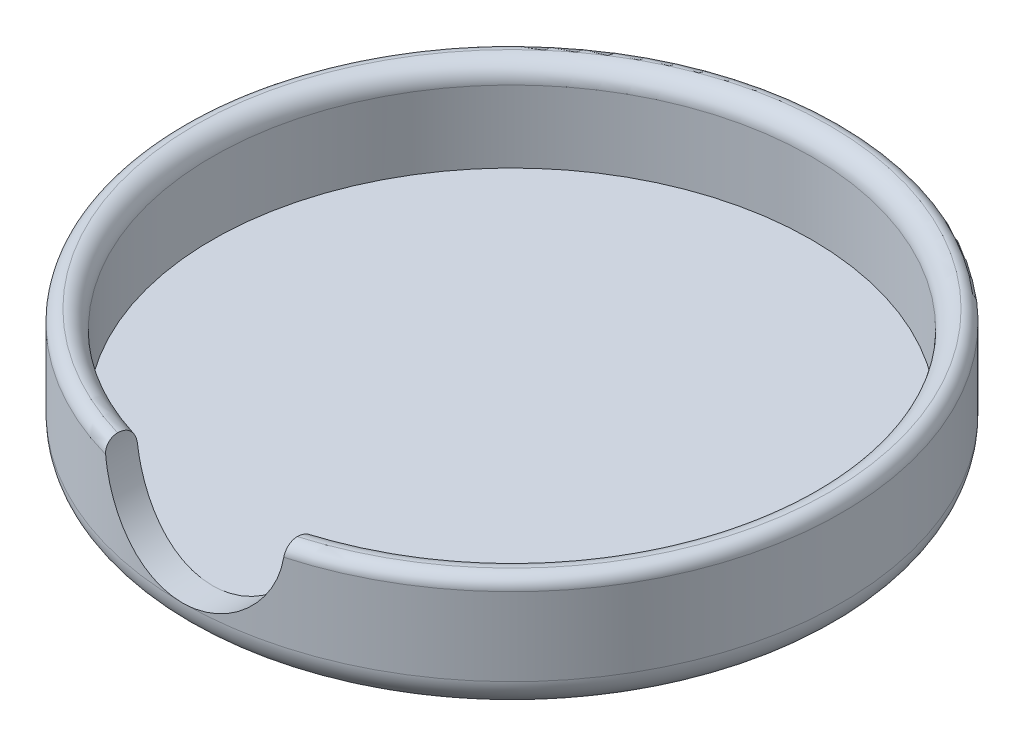
ISO-10303-21;
HEADER;
FILE_DESCRIPTION(('STEP AP214'),'2;1');
FILE_NAME('part.step','',(''),(''),'','','');
FILE_SCHEMA(('AUTOMOTIVE_DESIGN { 1 0 10303 214 1 1 1 1 }'));
ENDSEC;
DATA;
#1=APPLICATION_CONTEXT('core data for automotive mechanical design processes');
#2=APPLICATION_PROTOCOL_DEFINITION('international standard','automotive_design',2000,#1);
#3=PRODUCT_CONTEXT('',#1,'mechanical');
#4=PRODUCT('Part','Part','',(#3));
#5=PRODUCT_RELATED_PRODUCT_CATEGORY('part','',(#4));
#6=PRODUCT_DEFINITION_FORMATION('','',#4);
#7=PRODUCT_DEFINITION_CONTEXT('part definition',#1,'design');
#8=PRODUCT_DEFINITION('design','',#6,#7);
#9=PRODUCT_DEFINITION_SHAPE('','',#8);
#10=(LENGTH_UNIT() NAMED_UNIT(*) SI_UNIT(.MILLI.,.METRE.));
#11=(NAMED_UNIT(*) PLANE_ANGLE_UNIT() SI_UNIT($,.RADIAN.));
#12=(NAMED_UNIT(*) SI_UNIT($,.STERADIAN.) SOLID_ANGLE_UNIT());
#13=UNCERTAINTY_MEASURE_WITH_UNIT(LENGTH_MEASURE(1.E-05),#10,'distance_accuracy_value','');
#14=(GEOMETRIC_REPRESENTATION_CONTEXT(3) GLOBAL_UNCERTAINTY_ASSIGNED_CONTEXT((#13)) GLOBAL_UNIT_ASSIGNED_CONTEXT((#10,
#11,#12)) REPRESENTATION_CONTEXT('',''));
#15=CARTESIAN_POINT('',(0.,0.,0.));
#16=DIRECTION('',(0.,0.,1.));
#17=DIRECTION('',(1.,0.,0.));
#18=AXIS2_PLACEMENT_3D('',#15,#16,#17);
#19=CARTESIAN_POINT('',(0.,0.,0.));
#20=DIRECTION('',(0.,1.,0.));
#21=DIRECTION('',(0.,0.,1.));
#22=AXIS2_PLACEMENT_3D('',#19,#20,#21);
#23=PLANE('',#22);
#24=CARTESIAN_POINT('',(0.,0.,0.));
#25=DIRECTION('',(0.,1.,0.));
#26=DIRECTION('',(0.,0.,1.));
#27=AXIS2_PLACEMENT_3D('',#24,#25,#26);
#28=CIRCLE('',#27,50.);
#29=CARTESIAN_POINT('',(0.,0.,50.));
#30=VERTEX_POINT('',#29);
#31=EDGE_CURVE('E150',#30,#30,#28,.F.);
#32=ORIENTED_EDGE('',*,*,#31,.T.);
#33=EDGE_LOOP('',(#32));
#34=FACE_BOUND('',#33,.T.);
#35=ADVANCED_FACE('F37',(#34),#23,.F.);
#36=CARTESIAN_POINT('',(0.,5.,0.));
#37=DIRECTION('',(0.,1.,0.));
#38=DIRECTION('',(0.,0.,1.));
#39=AXIS2_PLACEMENT_3D('',#36,#37,#38);
#40=TOROIDAL_SURFACE('',#39,50.,5.);
#41=ORIENTED_EDGE('',*,*,#31,.F.);
#42=EDGE_LOOP('',(#41));
#43=FACE_BOUND('',#42,.T.);
#44=CARTESIAN_POINT('',(0.,5.,0.));
#45=DIRECTION('',(0.,1.,0.));
#46=DIRECTION('',(0.,0.,1.));
#47=AXIS2_PLACEMENT_3D('',#44,#45,#46);
#48=CIRCLE('',#47,55.);
#49=CARTESIAN_POINT('',(0.,5.,55.));
#50=VERTEX_POINT('',#49);
#51=EDGE_CURVE('E78',#50,#50,#48,.T.);
#52=ORIENTED_EDGE('',*,*,#51,.F.);
#53=EDGE_LOOP('',(#52));
#54=FACE_BOUND('',#53,.T.);
#55=ADVANCED_FACE('F163',(#43,#54),#40,.T.);
#56=CARTESIAN_POINT('',(0.,20.,0.));
#57=DIRECTION('',(0.,-1.,0.));
#58=DIRECTION('',(0.,0.,-1.));
#59=AXIS2_PLACEMENT_3D('',#56,#57,#58);
#60=CYLINDRICAL_SURFACE('',#59,55.);
#61=CARTESIAN_POINT('',(15.,20.,52.9150262212918));
#62=CARTESIAN_POINT('',(15.000000286484,19.793253766593,52.9150243606805));
#63=CARTESIAN_POINT('',(14.9957248566018,19.5865336685996,52.9162383360573));
#64=CARTESIAN_POINT('',(14.9786381452183,19.1734813981911,52.9210781578686));
#65=CARTESIAN_POINT('',(14.9658271362087,18.9671492136031,52.9247039273084));
#66=CARTESIAN_POINT('',(14.9146275967153,18.3493858365201,52.939165419406));
#67=CARTESIAN_POINT('',(14.8634725260349,17.9390189955834,52.9535853572906));
#68=CARTESIAN_POINT('',(14.7277230256131,17.1252798025082,52.9915001635927));
#69=CARTESIAN_POINT('',(14.6432029212191,16.7218939699774,53.0149748586115));
#70=CARTESIAN_POINT('',(14.4414416204866,15.9239608123837,53.0702901502028));
#71=CARTESIAN_POINT('',(14.3241998015573,15.5294136556472,53.1021309059544));
#72=CARTESIAN_POINT('',(14.0579925899012,14.7519879342244,53.1732244454477));
#73=CARTESIAN_POINT('',(13.9090354669678,14.3691063574208,53.2124752966989));
#74=CARTESIAN_POINT('',(13.580532442403,13.6174155385303,53.2972597334443));
#75=CARTESIAN_POINT('',(13.4009856434971,13.2486067096221,53.3427935032253));
#76=CARTESIAN_POINT('',(13.0125641270026,12.5273155157184,53.438873408806));
#77=CARTESIAN_POINT('',(12.8036805144758,12.1748381456976,53.4894210634479));
#78=CARTESIAN_POINT('',(12.3580738121259,11.4885122832305,53.5941263152665));
#79=CARTESIAN_POINT('',(12.1213503013955,11.1546640725482,53.6482839670167));
#80=CARTESIAN_POINT('',(11.6157480263671,10.5000298523626,53.760049965193));
#81=CARTESIAN_POINT('',(11.3462445131094,10.1797349413134,53.8177094871053));
#82=CARTESIAN_POINT('',(10.7814893898106,9.56283698102187,53.9336867559217));
#83=CARTESIAN_POINT('',(10.4862373723679,9.26623430678821,53.9920045132279));
#84=CARTESIAN_POINT('',(9.87183812277975,8.69859466716366,54.1077122406303));
#85=CARTESIAN_POINT('',(9.55268693451205,8.4275619513219,54.1651020552002));
#86=CARTESIAN_POINT('',(8.89257375010994,7.91292921446159,54.2773820471512));
#87=CARTESIAN_POINT('',(8.55161193459861,7.6693289663092,54.3322722452263));
#88=CARTESIAN_POINT('',(7.8441396117305,7.2073873948333,54.438952653567));
#89=CARTESIAN_POINT('',(7.47729524123745,6.98954126336078,54.4906749830409));
#90=CARTESIAN_POINT('',(6.72578893675184,6.58561436939836,54.5885274335198));
#91=CARTESIAN_POINT('',(6.34112674041055,6.39953407481611,54.634657472148));
#92=CARTESIAN_POINT('',(5.55674288938212,6.06066385099891,54.7199981149028));
#93=CARTESIAN_POINT('',(5.1570240051163,5.90786783223388,54.7592099844942));
#94=CARTESIAN_POINT('',(4.34535261171838,5.6368191553844,54.829588889452));
#95=CARTESIAN_POINT('',(3.93340044502747,5.51856553137133,54.8607561497715));
#96=CARTESIAN_POINT('',(3.11029369365135,5.32004771446635,54.9134961688321));
#97=CARTESIAN_POINT('',(2.69935519229585,5.23894340541183,54.9352803620332));
#98=CARTESIAN_POINT('',(1.87175827152191,5.11135302606664,54.9697009704869));
#99=CARTESIAN_POINT('',(1.45509993449401,5.06486645766144,54.9823375173649));
#100=CARTESIAN_POINT('',(0.619229104616363,5.00693347884404,54.9981023756115));
#101=CARTESIAN_POINT('',(0.200016951147234,4.99548251006537,55.0012319239041));
#102=CARTESIAN_POINT('',(-0.63785289854681,5.00771266536431,54.9978967075694));
#103=CARTESIAN_POINT('',(-1.05651060296149,5.03139326458745,54.991432086276));
#104=CARTESIAN_POINT('',(-1.8791020724344,5.11258054400319,54.9693895637102));
#105=CARTESIAN_POINT('',(-2.28313263881025,5.16917712722315,54.9540569160261));
#106=CARTESIAN_POINT('',(-3.08483628626953,5.31498120055762,54.9148873294678));
#107=CARTESIAN_POINT('',(-3.4825094984601,5.40418801724639,54.8910505662101));
#108=CARTESIAN_POINT('',(-4.26877655245749,5.61448067170427,54.8355075891585));
#109=CARTESIAN_POINT('',(-4.65737016388668,5.73556731740927,54.8038011759239));
#110=CARTESIAN_POINT('',(-5.42287685642636,6.00866123657067,54.7333551684439));
#111=CARTESIAN_POINT('',(-5.79978974686026,6.16066901447894,54.6946154594573));
#112=CARTESIAN_POINT('',(-6.54328689823865,6.49616956859676,54.6106839260597));
#113=CARTESIAN_POINT('',(-6.90972566963725,6.67996912978943,54.5654300307617));
#114=CARTESIAN_POINT('',(-7.62584778019487,7.07661065704846,54.4699637846654));
#115=CARTESIAN_POINT('',(-7.97553105508699,7.28945273449742,54.4197514148507));
#116=CARTESIAN_POINT('',(-8.65602032575576,7.7427380169607,54.3156682922352));
#117=CARTESIAN_POINT('',(-8.98682352174908,7.98318529979388,54.2617969994225));
#118=CARTESIAN_POINT('',(-9.62748178923056,8.49007166615788,54.1517982633528));
#119=CARTESIAN_POINT('',(-9.93733633098693,8.75651140654805,54.0956707630999));
#120=CARTESIAN_POINT('',(-10.5437633605139,9.32261439705751,53.9808051726502));
#121=CARTESIAN_POINT('',(-10.839593728764,9.62306786884385,53.9220410122898));
#122=CARTESIAN_POINT('',(-11.4049972003909,10.2478940419935,53.8052915194173));
#123=CARTESIAN_POINT('',(-11.6745695583015,10.5722674219852,53.7473062090571));
#124=CARTESIAN_POINT('',(-12.1857102945639,11.2429299846782,53.6337305040337));
#125=CARTESIAN_POINT('',(-12.427270364292,11.589225622818,53.578140822986));
#126=CARTESIAN_POINT('',(-12.8805852122529,12.3013843788892,53.4709714858905));
#127=CARTESIAN_POINT('',(-13.0923409112096,12.667246891874,53.4193917059898));
#128=CARTESIAN_POINT('',(-13.485917360652,13.4188680767393,53.3213980128598));
#129=CARTESIAN_POINT('',(-13.6675080202456,13.8047526177029,53.2750246095597));
#130=CARTESIAN_POINT('',(-13.9974007887952,14.5912471845914,53.1893019070663));
#131=CARTESIAN_POINT('',(-14.1457039997874,14.9918567225097,53.149952375345));
#132=CARTESIAN_POINT('',(-14.4076083963019,15.8044292724897,53.0795555363611));
#133=CARTESIAN_POINT('',(-14.5212520286767,16.2163777181054,53.0484980798267));
#134=CARTESIAN_POINT('',(-14.7130273766712,17.0488685590923,52.9956290923389));
#135=CARTESIAN_POINT('',(-14.7911756117696,17.4694068613406,52.973813260673));
#136=CARTESIAN_POINT('',(-14.900756361756,18.2416763291228,52.9430845986988));
#137=CARTESIAN_POINT('',(-14.93797953593,18.5925344011532,52.9325794870455));
#138=CARTESIAN_POINT('',(-14.9875941851518,19.2955855885039,52.9185425625314));
#139=CARTESIAN_POINT('',(-15.0000245351726,19.6477757448536,52.9149998328332));
#140=CARTESIAN_POINT('',(-15.,20.,52.9150262212918));
#141=B_SPLINE_CURVE_WITH_KNOTS('',3,(#61,#62,#63,#64,#65,#66,#67,#68,#69,#70,#71,#72,#73,#74,
#75,#76,#77,#78,#79,#80,#81,#82,#83,#84,#85,#86,#87,#88,#89,#90,#91,#92,#93,#94,#95,#96,#97,#98,
#99,#100,#101,#102,#103,#104,#105,#106,#107,#108,#109,#110,#111,#112,#113,#114,#115,#116,#117,
#118,#119,#120,#121,#122,#123,#124,#125,#126,#127,#128,#129,#130,#131,#132,#133,#134,#135,#136,
#137,#138,#139,#140),.UNSPECIFIED.,.F.,.F.,(4,2,2,2,2,2,2,2,2,2,2,2,2,2,2,2,2,2,2,2,2,2,2,2,2,2,
2,2,2,2,2,2,2,2,2,2,2,2,2,4),(0.,0.620138900214042,1.24025800392407,2.47999142352023,
3.7169786056949,4.95398932543055,6.19067788769116,7.42740273148229,8.66450336371224,
9.90162270188424,11.1678044068944,12.4340061494884,13.7004179566627,14.9668192774988,
16.2545751765416,17.5423500424654,18.8298891050804,20.1173921600613,21.3741351828254,
22.6308601219696,23.8874215458165,25.1439641972239,26.3673132020691,27.5906369452685,
28.8139916943529,30.0373664030261,31.2732821716043,32.5092026802458,33.7453059935533,
34.981440552711,36.2571240535089,37.5328437604792,38.8089408914567,40.084998592273,
41.3703823826527,42.6557236119905,43.9394843309463,45.2226469767977,46.2806787333041,
47.3370501951861),.UNSPECIFIED.);
#142=CARTESIAN_POINT('',(-14.8660687473185,18.,52.9528091794949));
#143=VERTEX_POINT('',#142);
#144=EDGE_CURVE('E81',#50,#143,#141,.T.);
#145=ORIENTED_EDGE('',*,*,#144,.T.);
#146=CARTESIAN_POINT('',(0.,18.,0.));
#147=DIRECTION('',(0.,1.,0.));
#148=DIRECTION('',(0.,0.,1.));
#149=AXIS2_PLACEMENT_3D('',#146,#147,#148);
#150=CIRCLE('',#149,55.);
#151=CARTESIAN_POINT('',(14.8660687473185,18.,52.9528091794949));
#152=VERTEX_POINT('',#151);
#153=EDGE_CURVE('E11',#143,#152,#150,.F.);
#154=ORIENTED_EDGE('',*,*,#153,.T.);
#155=EDGE_CURVE('E75',#152,#50,#141,.T.);
#156=ORIENTED_EDGE('',*,*,#155,.T.);
#157=ORIENTED_EDGE('',*,*,#51,.T.);
#158=EDGE_LOOP('',(#145,#154,#156,#157));
#159=FACE_BOUND('',#158,.T.);
#160=ADVANCED_FACE('F76',(#159),#60,.T.);
#161=CARTESIAN_POINT('',(0.,20.,0.));
#162=DIRECTION('',(0.,-1.,0.));
#163=DIRECTION('',(0.,0.,-1.));
#164=AXIS2_PLACEMENT_3D('',#161,#162,#163);
#165=CYLINDRICAL_SURFACE('',#164,50.);
#166=CARTESIAN_POINT('',(15.,20.,47.6969600708473));
#167=CARTESIAN_POINT('',(15.0000003889095,19.7941501732648,47.6969579742863));
#168=CARTESIAN_POINT('',(14.995761832774,19.588326593931,47.698293162149));
#169=CARTESIAN_POINT('',(14.9788232737872,19.1770691419399,47.7036158737301));
#170=CARTESIAN_POINT('',(14.9661235555923,18.9716352564053,47.7076033082196));
#171=CARTESIAN_POINT('',(14.9153717989047,18.3565837808963,47.7235060994854));
#172=CARTESIAN_POINT('',(14.8646671266603,17.9480344712138,47.7393619823185));
#173=CARTESIAN_POINT('',(14.7301568952093,17.138067703379,47.7810357940474));
#174=CARTESIAN_POINT('',(14.6464353843022,16.7366348199901,47.8068284239475));
#175=CARTESIAN_POINT('',(14.4466286147373,15.942598338537,47.8675862712463));
#176=CARTESIAN_POINT('',(14.330542509718,15.5499949716624,47.9025517285207));
#177=CARTESIAN_POINT('',(14.0670437451883,14.7764795639158,47.9805911847024));
#178=CARTESIAN_POINT('',(13.9196444614747,14.3955626103113,48.0236617205348));
#179=CARTESIAN_POINT('',(13.5946485885919,13.6476954439964,48.1166715324081));
#180=CARTESIAN_POINT('',(13.4170505721524,13.2807458924253,48.1666111330775));
#181=CARTESIAN_POINT('',(13.0328965560348,12.5629729240647,48.2719718972924));
#182=CARTESIAN_POINT('',(12.8263290279107,12.2121560014373,48.3273952405002));
#183=CARTESIAN_POINT('',(12.3857134859258,11.5289106915811,48.4421914708305));
#184=CARTESIAN_POINT('',(12.1516649536736,11.1964826514075,48.5015644324479));
#185=CARTESIAN_POINT('',(11.6506113351625,10.5428553911695,48.62439344723));
#186=CARTESIAN_POINT('',(11.3828612763641,10.2222398027943,48.6879174914708));
#187=CARTESIAN_POINT('',(10.8215339572438,9.60439081211421,48.8157482463396));
#188=CARTESIAN_POINT('',(10.5279455259353,9.30716762954353,48.8800552850324));
#189=CARTESIAN_POINT('',(9.91683444397871,8.73808409132432,49.0076915080054));
#190=CARTESIAN_POINT('',(9.59930744076928,8.46622836824561,49.0710205119229));
#191=CARTESIAN_POINT('',(8.94249344375567,7.94984447801747,49.194953354915));
#192=CARTESIAN_POINT('',(8.60321622674639,7.70530416619189,49.2555583978665));
#193=CARTESIAN_POINT('',(7.89756823122333,7.24027130158309,49.3736673216473));
#194=CARTESIAN_POINT('',(7.53077853302729,7.02039046274019,49.4310795373602));
#195=CARTESIAN_POINT('',(6.77904273425942,6.61241371938345,49.5397697835293));
#196=CARTESIAN_POINT('',(6.39409630593465,6.42431838892107,49.5910477031942));
#197=CARTESIAN_POINT('',(5.60880320879665,6.08149307500941,49.6859909489852));
#198=CARTESIAN_POINT('',(5.20845977838391,5.92675612013977,49.7296578653354));
#199=CARTESIAN_POINT('',(4.39520060136136,5.65195419568689,49.8081224359834));
#200=CARTESIAN_POINT('',(3.98228528549838,5.53188803966272,49.8429203937739));
#201=CARTESIAN_POINT('',(3.15894033806654,5.3304550989793,49.901768885877));
#202=CARTESIAN_POINT('',(2.74877721618913,5.24807994449658,49.9260982718472));
#203=CARTESIAN_POINT('',(1.92253965661192,5.11783834753897,49.9647361358942));
#204=CARTESIAN_POINT('',(1.50646532111026,5.06997130919668,49.9790447870034));
#205=CARTESIAN_POINT('',(0.671610704494645,5.00920007875691,49.9972323233512));
#206=CARTESIAN_POINT('',(0.252830869396635,4.99629026412887,50.0011128858461));
#207=CARTESIAN_POINT('',(-0.584302229521179,5.00554101280201,49.9983377463342));
#208=CARTESIAN_POINT('',(-1.00265550102857,5.0277009324796,49.9916822376926));
#209=CARTESIAN_POINT('',(-1.8224486351288,5.1056125459242,49.9684046025299));
#210=CARTESIAN_POINT('',(-2.22400229724789,5.16027004841412,49.9521072026892));
#211=CARTESIAN_POINT('',(-3.02089524646481,5.30177047981183,49.9102533229668));
#212=CARTESIAN_POINT('',(-3.41623468866895,5.38861260406076,49.8846970745692));
#213=CARTESIAN_POINT('',(-4.19800641917877,5.59374909857315,49.8249982033547));
#214=CARTESIAN_POINT('',(-4.58443847730663,5.71204428063455,49.7908553589205));
#215=CARTESIAN_POINT('',(-5.34583465510292,5.97912890658356,49.7148714889189));
#216=CARTESIAN_POINT('',(-5.72079855746855,6.12791892788762,49.673030317586));
#217=CARTESIAN_POINT('',(-6.46115095010849,6.45675455222343,49.5821968751376));
#218=CARTESIAN_POINT('',(-6.82637732039217,6.63714359582107,49.5331270820297));
#219=CARTESIAN_POINT('',(-7.54035945480179,7.02662898960079,49.4294763317497));
#220=CARTESIAN_POINT('',(-7.8891151525986,7.23572545537741,49.3748953523862));
#221=CARTESIAN_POINT('',(-8.56803716704038,7.68116992159519,49.2616198825843));
#222=CARTESIAN_POINT('',(-8.89820407400544,7.91751705591564,49.2029255229066));
#223=CARTESIAN_POINT('',(-9.53815224156826,8.41603484033953,49.0828860973296));
#224=CARTESIAN_POINT('',(-9.84792414417951,8.67821720874773,49.0215398357318));
#225=CARTESIAN_POINT('',(-10.4566034857912,9.23725425905131,48.8953958608283));
#226=CARTESIAN_POINT('',(-10.7546340189113,9.53505498174446,48.8305561775212));
#227=CARTESIAN_POINT('',(-11.3245473039692,10.1546089271156,48.7015398324928));
#228=CARTESIAN_POINT('',(-11.5964404570827,10.4763525307172,48.6373629161791));
#229=CARTESIAN_POINT('',(-12.1125565846131,11.1420409203665,48.511406810039));
#230=CARTESIAN_POINT('',(-12.3567649730013,11.485997261032,48.4496288953184));
#231=CARTESIAN_POINT('',(-12.8156383043254,12.1937664280579,48.3302766287358));
#232=CARTESIAN_POINT('',(-13.0303041164028,12.5575786698183,48.2727021532322));
#233=CARTESIAN_POINT('',(-13.4305410102192,13.3065204549406,48.1628912766948));
#234=CARTESIAN_POINT('',(-13.6157929149094,13.6918296157015,48.1107153290439));
#235=CARTESIAN_POINT('',(-13.9530128127913,14.4776610651758,48.0140002793618));
#236=CARTESIAN_POINT('',(-14.1049825348845,14.8781825623889,47.9694607806679));
#237=CARTESIAN_POINT('',(-14.3741536517861,15.6910803320151,47.8894918633125));
#238=CARTESIAN_POINT('',(-14.4913978254708,16.1034413260872,47.8540512428513));
#239=CARTESIAN_POINT('',(-14.690236559829,16.9372329414496,47.7933858094495));
#240=CARTESIAN_POINT('',(-14.771847563816,17.3586592850303,47.7681562848812));
#241=CARTESIAN_POINT('',(-14.8900782944279,18.1498426778298,47.7314258512844));
#242=CARTESIAN_POINT('',(-14.9312992821192,18.5188542745184,47.7185269285795));
#243=CARTESIAN_POINT('',(-14.9862565472962,19.2585677800712,47.7012815767789));
#244=CARTESIAN_POINT('',(-15.0000332375231,19.6292663967043,47.6969225724948));
#245=CARTESIAN_POINT('',(-15.,20.,47.6969600708473));
#246=B_SPLINE_CURVE_WITH_KNOTS('',3,(#166,#167,#168,#169,#170,#171,#172,#173,#174,#175,#176,
#177,#178,#179,#180,#181,#182,#183,#184,#185,#186,#187,#188,#189,#190,#191,#192,#193,#194,#195,
#196,#197,#198,#199,#200,#201,#202,#203,#204,#205,#206,#207,#208,#209,#210,#211,#212,#213,#214,
#215,#216,#217,#218,#219,#220,#221,#222,#223,#224,#225,#226,#227,#228,#229,#230,#231,#232,#233,
#234,#235,#236,#237,#238,#239,#240,#241,#242,#243,#244,#245),.UNSPECIFIED.,.F.,.F.,(4,2,2,2,2,2,
2,2,2,2,2,2,2,2,2,2,2,2,2,2,2,2,2,2,2,2,2,2,2,2,2,2,2,2,2,2,2,2,2,4),(0.,0.617449294555536,
1.23487781749013,2.46919099384916,3.70038215343374,4.93160551272877,6.16230399405887,
7.3930606575572,8.62430849907352,9.85557957012567,11.1216799464605,12.3883304244294,
13.6552117654775,14.9215275787088,16.21439427124,17.5072843106595,18.7999038921774,
20.0924792347793,21.3480959729492,22.6036910292923,23.8590841233432,25.1144541778342,
26.3297756493565,27.5450667382563,28.7603891966532,29.9757346691738,31.2052173654956,
32.4347050126507,33.6641535931922,34.8941624146819,36.1715076051491,37.4483423629625,
38.7258467394004,40.00331352366,41.2938134064156,42.5842462359757,43.8730826877586,
45.161323761752,46.2748198923124,47.3866751430932),.UNSPECIFIED.);
#247=CARTESIAN_POINT('',(14.6969384566991,17.,47.7912125813941));
#248=VERTEX_POINT('',#247);
#249=CARTESIAN_POINT('',(0.,5.,50.));
#250=VERTEX_POINT('',#249);
#251=EDGE_CURVE('E80',#248,#250,#246,.T.);
#252=ORIENTED_EDGE('',*,*,#251,.F.);
#253=CARTESIAN_POINT('',(0.,17.,0.));
#254=DIRECTION('',(0.,1.,0.));
#255=DIRECTION('',(0.,0.,1.));
#256=AXIS2_PLACEMENT_3D('',#253,#254,#255);
#257=CIRCLE('',#256,50.);
#258=CARTESIAN_POINT('',(-14.6969384566991,17.,47.7912125813941));
#259=VERTEX_POINT('',#258);
#260=EDGE_CURVE('E141',#248,#259,#257,.T.);
#261=ORIENTED_EDGE('',*,*,#260,.T.);
#262=EDGE_CURVE('E84',#250,#259,#246,.T.);
#263=ORIENTED_EDGE('',*,*,#262,.F.);
#264=CARTESIAN_POINT('',(0.,5.,0.));
#265=DIRECTION('',(0.,1.,0.));
#266=DIRECTION('',(0.,0.,1.));
#267=AXIS2_PLACEMENT_3D('',#264,#265,#266);
#268=CIRCLE('',#267,50.);
#269=EDGE_CURVE('E145',#250,#250,#268,.F.);
#270=ORIENTED_EDGE('',*,*,#269,.T.);
#271=EDGE_LOOP('',(#252,#261,#263,#270));
#272=FACE_BOUND('',#271,.T.);
#273=ADVANCED_FACE('F106',(#272),#165,.F.);
#274=CARTESIAN_POINT('',(0.,5.,0.));
#275=DIRECTION('',(0.,1.,0.));
#276=DIRECTION('',(0.,0.,1.));
#277=AXIS2_PLACEMENT_3D('',#274,#275,#276);
#278=PLANE('',#277);
#279=ORIENTED_EDGE('',*,*,#269,.F.);
#280=EDGE_LOOP('',(#279));
#281=FACE_BOUND('',#280,.T.);
#282=ADVANCED_FACE('F105',(#281),#278,.T.);
#283=CARTESIAN_POINT('',(0.,20.,25.));
#284=DIRECTION('',(0.,0.,1.));
#285=DIRECTION('',(1.,0.,0.));
#286=AXIS2_PLACEMENT_3D('',#283,#284,#285);
#287=CYLINDRICAL_SURFACE('',#286,15.);
#288=CARTESIAN_POINT('',(-14.6969384566991,17.,47.7912125813941));
#289=CARTESIAN_POINT('',(-14.7120348119623,17.0739298017611,47.786559409405));
#290=CARTESIAN_POINT('',(-14.7266016794192,17.1481657342019,47.7849417844082));
#291=CARTESIAN_POINT('',(-14.7545948839799,17.2967420814538,47.7878729639709));
#292=CARTESIAN_POINT('',(-14.7680210329612,17.3710825114511,47.7924227835492));
#293=CARTESIAN_POINT('',(-14.7936261249421,17.5192191309981,47.8077737343045));
#294=CARTESIAN_POINT('',(-14.8058069911024,17.593015991284,47.8185650493702));
#295=CARTESIAN_POINT('',(-14.82889493732,17.7396034144872,47.846366423258));
#296=CARTESIAN_POINT('',(-14.8398021362279,17.8123940707375,47.8633759012274));
#297=CARTESIAN_POINT('',(-14.8706071939336,18.0286649130938,47.92370200921));
#298=CARTESIAN_POINT('',(-14.8885730324226,18.1699535474527,47.9763069881235));
#299=CARTESIAN_POINT('',(-14.9195120246769,18.4421171148056,48.1044912646301));
#300=CARTESIAN_POINT('',(-14.9324861230248,18.5729940142817,48.1800662107861));
#301=CARTESIAN_POINT('',(-14.9540966159327,18.8208263694388,48.3513462672654));
#302=CARTESIAN_POINT('',(-14.9627411644069,18.937807675401,48.4470130521019));
#303=CARTESIAN_POINT('',(-14.9766148825672,19.1556353412394,48.6554281638183));
#304=CARTESIAN_POINT('',(-14.9818427453489,19.2564755159056,48.7681830066994));
#305=CARTESIAN_POINT('',(-14.9901152370897,19.4466903165632,49.0159053252344));
#306=CARTESIAN_POINT('',(-14.9929807149161,19.5347620185703,49.1518767405637));
#307=CARTESIAN_POINT('',(-14.9969742438422,19.688963746962,49.4358977556296));
#308=CARTESIAN_POINT('',(-14.9981010067972,19.7550774771281,49.5839562247648));
#309=CARTESIAN_POINT('',(-14.9991911908434,19.8411543642142,49.823814899378));
#310=CARTESIAN_POINT('',(-14.999445040029,19.8688120999896,49.9129384058167));
#311=CARTESIAN_POINT('',(-14.9997856704229,19.9163466014505,50.0932727655061));
#312=CARTESIAN_POINT('',(-14.9998724231733,19.9362220412909,50.1844839716323));
#313=CARTESIAN_POINT('',(-14.9999748902488,19.9680639723992,50.3682555303574));
#314=CARTESIAN_POINT('',(-14.9999906158625,19.9800317202146,50.4608156662186));
#315=CARTESIAN_POINT('',(-14.9999998116302,19.9960020482673,50.646603011775));
#316=CARTESIAN_POINT('',(-14.9999932859657,20.0000061248235,50.7398300928513));
#317=CARTESIAN_POINT('',(-15.,20.,50.8330601085553));
#318=B_SPLINE_CURVE_WITH_KNOTS('',3,(#288,#289,#290,#291,#292,#293,#294,#295,#296,#297,#298,
#299,#300,#301,#302,#303,#304,#305,#306,#307,#308,#309,#310,#311,#312,#313,#314,#315,#316,#317),
.UNSPECIFIED.,.F.,.F.,(4,2,2,2,2,2,2,2,2,2,2,2,2,2,4),(0.,0.226742568152097,0.453522457420532,
0.67994665200107,0.906349701187054,1.35942884161699,1.81242220404915,2.26455919790068,
2.71686903600411,3.20095040446097,3.68539023768147,3.96503853441373,4.24473445322778,
4.5243859171237,4.8039848314698),.UNSPECIFIED.);
#319=CARTESIAN_POINT('',(-15.,20.,50.8330601085553));
#320=VERTEX_POINT('',#319);
#321=EDGE_CURVE('E121',#259,#320,#318,.T.);
#322=ORIENTED_EDGE('',*,*,#321,.T.);
#323=CARTESIAN_POINT('',(-15.,20.,50.8330601085553));
#324=CARTESIAN_POINT('',(-14.9999979299274,19.9999983708863,50.8936470613453));
#325=CARTESIAN_POINT('',(-15.0000002403557,19.9974658930513,50.9542058460902));
#326=CARTESIAN_POINT('',(-14.9999959173064,19.9873503286358,51.0749016987868));
#327=CARTESIAN_POINT('',(-14.9999892835565,19.9797670883372,51.1350387538469));
#328=CARTESIAN_POINT('',(-14.9999294405642,19.9494755642157,51.3141603415204));
#329=CARTESIAN_POINT('',(-14.9998363472102,19.9192254281824,51.4319613632789));
#330=CARTESIAN_POINT('',(-14.9991915909473,19.8392735682164,51.6608277902478));
#331=CARTESIAN_POINT('',(-14.9986395231416,19.7895546898971,51.7718871552659));
#332=CARTESIAN_POINT('',(-14.9965271355259,19.6719500607866,51.9838842086644));
#333=CARTESIAN_POINT('',(-14.9949673089723,19.6040732070969,52.0848268208741));
#334=CARTESIAN_POINT('',(-14.9902138360981,19.4531047776714,52.2722055955277));
#335=CARTESIAN_POINT('',(-14.9870436435234,19.3702423144296,52.3588269721112));
#336=CARTESIAN_POINT('',(-14.978436158108,19.1910011930052,52.5166816310734));
#337=CARTESIAN_POINT('',(-14.9729981912503,19.0946185220679,52.5879103289505));
#338=CARTESIAN_POINT('',(-14.9594362015076,18.8930756329532,52.7116061107735));
#339=CARTESIAN_POINT('',(-14.9513624495473,18.7881053188771,52.7643887247273));
#340=CARTESIAN_POINT('',(-14.9321757964314,18.5710345846415,52.8512992746475));
#341=CARTESIAN_POINT('',(-14.9210665082048,18.4589427615416,52.885449243499));
#342=CARTESIAN_POINT('',(-14.9021085902116,18.2881407143192,52.9218817550779));
#343=CARTESIAN_POINT('',(-14.8954106058065,18.2307899748657,52.9315594497349));
#344=CARTESIAN_POINT('',(-14.8812834685946,18.1156514881742,52.9459259144236));
#345=CARTESIAN_POINT('',(-14.8738555092296,18.0578645922682,52.9506226842854));
#346=CARTESIAN_POINT('',(-14.8660687473185,18.,52.9528091794949));
#347=B_SPLINE_CURVE_WITH_KNOTS('',3,(#323,#324,#325,#326,#327,#328,#329,#330,#331,#332,#333,
#334,#335,#336,#337,#338,#339,#340,#341,#342,#343,#344,#345,#346),.UNSPECIFIED.,.F.,.F.,(4,2,2,
2,2,2,2,2,2,2,2,4),(0.,0.181651458272724,0.363308445299824,0.726308216380331,1.08962855780466,
1.45277120343185,1.8107704281828,2.16887613166233,2.52051605053598,2.87173925313677,
3.0471875124087,3.22235355665244),.UNSPECIFIED.);
#348=EDGE_CURVE('E46',#320,#143,#347,.T.);
#349=ORIENTED_EDGE('',*,*,#348,.T.);
#350=ORIENTED_EDGE('',*,*,#144,.F.);
#351=ORIENTED_EDGE('',*,*,#155,.F.);
#352=CARTESIAN_POINT('',(14.8660687473185,18.,52.9528091794949));
#353=CARTESIAN_POINT('',(14.8737344894322,18.056965836715,52.9506567905756));
#354=CARTESIAN_POINT('',(14.8810526820142,18.1138570051467,52.9460713033025));
#355=CARTESIAN_POINT('',(14.8949712463802,18.2271268678259,52.9320914873618));
#356=CARTESIAN_POINT('',(14.901571708976,18.2835056260777,52.9226977679232));
#357=CARTESIAN_POINT('',(14.9202378119825,18.4511043770487,52.887440275375));
#358=CARTESIAN_POINT('',(14.9312020568797,18.5610404347909,52.8544901592903));
#359=CARTESIAN_POINT('',(14.9502048543968,18.774091648864,52.7707250408638));
#360=CARTESIAN_POINT('',(14.9582430645201,18.87720600555,52.7199079485348));
#361=CARTESIAN_POINT('',(14.9717013940908,19.0737881903394,52.6018970996156));
#362=CARTESIAN_POINT('',(14.9771215465137,19.1672561399311,52.5347035493092));
#363=CARTESIAN_POINT('',(14.9858643111181,19.3429519737103,52.3850261291857));
#364=CARTESIAN_POINT('',(14.9891627483154,19.4250422287437,52.3023794202125));
#365=CARTESIAN_POINT('',(14.9941516341175,19.5745285371808,52.1246567178017));
#366=CARTESIAN_POINT('',(14.9958416943669,19.6419210386686,52.0295777287914));
#367=CARTESIAN_POINT('',(14.9982205677137,19.7612285556919,51.8280531843219));
#368=CARTESIAN_POINT('',(14.9988925570686,19.8128724726871,51.7214471900594));
#369=CARTESIAN_POINT('',(14.999713074027,19.8978868348586,51.5012066889957));
#370=CARTESIAN_POINT('',(14.9998618434743,19.9312657165126,51.3875754541384));
#371=CARTESIAN_POINT('',(14.9999774080322,19.97008370789,51.1998309118259));
#372=CARTESIAN_POINT('',(14.9999914963916,19.981305232386,51.126860647754));
#373=CARTESIAN_POINT('',(15.000000116116,19.9962584591036,50.9802891848788));
#374=CARTESIAN_POINT('',(14.9999946826629,20.0000036161046,50.9066893593163));
#375=CARTESIAN_POINT('',(15.,20.,50.8330601085553));
#376=B_SPLINE_CURVE_WITH_KNOTS('',3,(#352,#353,#354,#355,#356,#357,#358,#359,#360,#361,#362,
#363,#364,#365,#366,#367,#368,#369,#370,#371,#372,#373,#374,#375),.UNSPECIFIED.,.F.,.F.,(4,2,2,
2,2,2,2,2,2,2,2,4),(0.,0.172449157618882,0.344876470399326,0.688972870244446,1.03310953412052,
1.37724186335323,1.72522888250333,2.07329990458364,2.42706240193062,2.78066136090844,
3.00179333049687,3.22252698180896),.UNSPECIFIED.);
#377=CARTESIAN_POINT('',(15.,20.,50.8330601085553));
#378=VERTEX_POINT('',#377);
#379=EDGE_CURVE('E128',#152,#378,#376,.T.);
#380=ORIENTED_EDGE('',*,*,#379,.T.);
#381=CARTESIAN_POINT('',(15.,20.,50.8330601085553));
#382=CARTESIAN_POINT('',(14.9999954237738,19.9999971640053,50.7423933183878));
#383=CARTESIAN_POINT('',(15.0000005439366,19.9962169674958,50.6517698491736));
#384=CARTESIAN_POINT('',(14.9999909037233,19.981130247744,50.4711474310951));
#385=CARTESIAN_POINT('',(14.9999761423946,19.9698233639139,50.3811485123604));
#386=CARTESIAN_POINT('',(14.9998430729119,19.9246408555327,50.1128196571317));
#387=CARTESIAN_POINT('',(14.9996359056892,19.8795034300258,49.9362488357317));
#388=CARTESIAN_POINT('',(14.9981988296702,19.7600647039441,49.5931393703986));
#389=CARTESIAN_POINT('',(14.9969679469004,19.6857356657253,49.4266104423111));
#390=CARTESIAN_POINT('',(14.992231756061,19.509341184666,49.1089886826861));
#391=CARTESIAN_POINT('',(14.9887277018107,19.4072910500513,48.9578873948274));
#392=CARTESIAN_POINT('',(14.978062274733,19.1814978984734,48.6813576367774));
#393=CARTESIAN_POINT('',(14.9710280789565,19.0586014319505,48.5552358121155));
#394=CARTESIAN_POINT('',(14.9518806216483,18.7920882161869,48.3277393746959));
#395=CARTESIAN_POINT('',(14.9397712622532,18.648487441376,48.2263458436621));
#396=CARTESIAN_POINT('',(14.9105191055659,18.3581273718362,48.0604256860985));
#397=CARTESIAN_POINT('',(14.8939014537556,18.212712399952,47.9934710362768));
#398=CARTESIAN_POINT('',(14.8646567980711,17.988102594025,47.9134140524178));
#399=CARTESIAN_POINT('',(14.8541849138249,17.9121265428477,47.8901201090815));
#400=CARTESIAN_POINT('',(14.8317947423696,17.7585996317319,47.8504646542892));
#401=CARTESIAN_POINT('',(14.819876839784,17.6810491951111,47.8341013045555));
#402=CARTESIAN_POINT('',(14.7910633764963,17.5030715189214,47.8047969350889));
#403=CARTESIAN_POINT('',(14.7737104118067,17.4023425873986,47.7941116239361));
#404=CARTESIAN_POINT('',(14.7368768060851,17.2008767462479,47.7841606521457));
#405=CARTESIAN_POINT('',(14.7173996835495,17.1001401179103,47.7848763835661));
#406=CARTESIAN_POINT('',(14.6969384566991,17.,47.7912125813941));
#407=B_SPLINE_CURVE_WITH_KNOTS('',3,(#381,#382,#383,#384,#385,#386,#387,#388,#389,#390,#391,
#392,#393,#394,#395,#396,#397,#398,#399,#400,#401,#402,#403,#404,#405,#406),.UNSPECIFIED.,.F.,
.F.,(4,2,2,2,2,2,2,2,2,2,2,2,4),(0.,0.271835364823841,0.543683753652986,1.08765077340602,
1.63213592182616,2.17632100215838,2.7021746074402,3.22762463970154,3.70768607119215,
3.94786775893023,4.18798570068075,4.49561421397598,4.80274069018686),.UNSPECIFIED.);
#408=EDGE_CURVE('E114',#378,#248,#407,.T.);
#409=ORIENTED_EDGE('',*,*,#408,.T.);
#410=ORIENTED_EDGE('',*,*,#251,.T.);
#411=ORIENTED_EDGE('',*,*,#262,.T.);
#412=EDGE_LOOP('',(#322,#349,#350,#351,#380,#409,#410,#411));
#413=FACE_BOUND('',#412,.T.);
#414=ADVANCED_FACE('F83',(#413),#287,.F.);
#415=CARTESIAN_POINT('',(0.,17.,0.));
#416=DIRECTION('',(0.,1.,0.));
#417=DIRECTION('',(0.,0.,1.));
#418=AXIS2_PLACEMENT_3D('',#415,#416,#417);
#419=TOROIDAL_SURFACE('',#418,53.,3.);
#420=ORIENTED_EDGE('',*,*,#408,.F.);
#421=CARTESIAN_POINT('',(0.,20.,0.));
#422=DIRECTION('',(0.,1.,0.));
#423=DIRECTION('',(0.,0.,1.));
#424=AXIS2_PLACEMENT_3D('',#421,#422,#423);
#425=CIRCLE('',#424,53.);
#426=EDGE_CURVE('E133',#320,#378,#425,.F.);
#427=ORIENTED_EDGE('',*,*,#426,.F.);
#428=ORIENTED_EDGE('',*,*,#321,.F.);
#429=ORIENTED_EDGE('',*,*,#260,.F.);
#430=EDGE_LOOP('',(#420,#427,#428,#429));
#431=FACE_BOUND('',#430,.T.);
#432=ADVANCED_FACE('F104',(#431),#419,.T.);
#433=CARTESIAN_POINT('',(0.,18.,0.));
#434=DIRECTION('',(0.,1.,0.));
#435=DIRECTION('',(0.,0.,1.));
#436=AXIS2_PLACEMENT_3D('',#433,#434,#435);
#437=TOROIDAL_SURFACE('',#436,53.,2.);
#438=ORIENTED_EDGE('',*,*,#379,.F.);
#439=ORIENTED_EDGE('',*,*,#153,.F.);
#440=ORIENTED_EDGE('',*,*,#348,.F.);
#441=ORIENTED_EDGE('',*,*,#426,.T.);
#442=EDGE_LOOP('',(#438,#439,#440,#441));
#443=FACE_BOUND('',#442,.T.);
#444=ADVANCED_FACE('F39',(#443),#437,.T.);
#445=CLOSED_SHELL('',(#35,#55,#160,#273,#282,#414,#432,#444));
#446=MANIFOLD_SOLID_BREP('B2',#445);
#447=ADVANCED_BREP_SHAPE_REPRESENTATION('',(#18,#446),#14);
#448=SHAPE_DEFINITION_REPRESENTATION(#9,#447);
ENDSEC;
END-ISO-10303-21;
